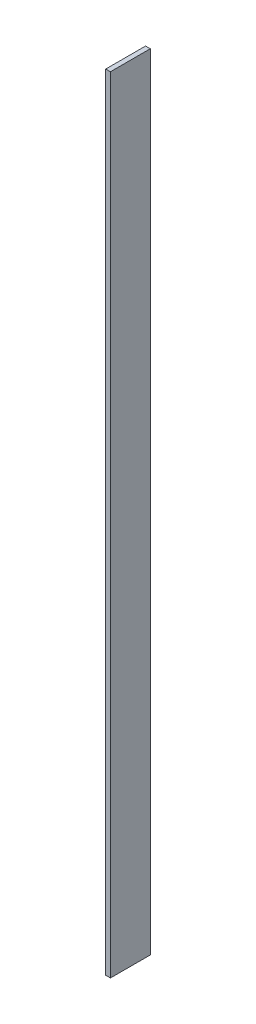
ISO-10303-21;
HEADER;
FILE_DESCRIPTION(('STEP AP214'),'2;1');
FILE_NAME('part.step','',(''),(''),'','','');
FILE_SCHEMA(('AUTOMOTIVE_DESIGN { 1 0 10303 214 1 1 1 1 }'));
ENDSEC;
DATA;
#1=APPLICATION_CONTEXT('core data for automotive mechanical design processes');
#2=APPLICATION_PROTOCOL_DEFINITION('international standard','automotive_design',2000,#1);
#3=PRODUCT_CONTEXT('',#1,'mechanical');
#4=PRODUCT('Part','Part','',(#3));
#5=PRODUCT_RELATED_PRODUCT_CATEGORY('part','',(#4));
#6=PRODUCT_DEFINITION_FORMATION('','',#4);
#7=PRODUCT_DEFINITION_CONTEXT('part definition',#1,'design');
#8=PRODUCT_DEFINITION('design','',#6,#7);
#9=PRODUCT_DEFINITION_SHAPE('','',#8);
#10=(LENGTH_UNIT() NAMED_UNIT(*) SI_UNIT(.MILLI.,.METRE.));
#11=(NAMED_UNIT(*) PLANE_ANGLE_UNIT() SI_UNIT($,.RADIAN.));
#12=(NAMED_UNIT(*) SI_UNIT($,.STERADIAN.) SOLID_ANGLE_UNIT());
#13=UNCERTAINTY_MEASURE_WITH_UNIT(LENGTH_MEASURE(1.E-05),#10,'distance_accuracy_value','');
#14=(GEOMETRIC_REPRESENTATION_CONTEXT(3) GLOBAL_UNCERTAINTY_ASSIGNED_CONTEXT((#13)) GLOBAL_UNIT_ASSIGNED_CONTEXT((#10,
#11,#12)) REPRESENTATION_CONTEXT('',''));
#15=CARTESIAN_POINT('',(0.,0.,0.));
#16=DIRECTION('',(0.,0.,1.));
#17=DIRECTION('',(1.,0.,0.));
#18=AXIS2_PLACEMENT_3D('',#15,#16,#17);
#19=CARTESIAN_POINT('',(3.00000000000045,0.,25.4000000000001));
#20=DIRECTION('',(-1.,0.,0.));
#21=DIRECTION('',(0.,0.,0.999999999999999));
#22=AXIS2_PLACEMENT_3D('',#19,#20,#21);
#23=PLANE('',#22);
#24=DIRECTION('',(0.,1.,0.));
#25=VECTOR('',#24,1.);
#26=CARTESIAN_POINT('',(3.00000000000045,-2.22044604925031E-13,0.));
#27=LINE('',#26,#25);
#28=CARTESIAN_POINT('',(3.00000000000045,-2.22044604925031E-13,0.));
#29=VERTEX_POINT('',#28);
#30=CARTESIAN_POINT('',(3.,500.,0.));
#31=VERTEX_POINT('',#30);
#32=EDGE_CURVE('E109',#29,#31,#27,.T.);
#33=ORIENTED_EDGE('',*,*,#32,.T.);
#34=DIRECTION('',(0.,0.,-0.999999999999999));
#35=VECTOR('',#34,1.);
#36=CARTESIAN_POINT('',(2.99999999999956,500.,25.3999999999999));
#37=LINE('',#36,#35);
#38=CARTESIAN_POINT('',(2.99999999999956,500.,25.3999999999999));
#39=VERTEX_POINT('',#38);
#40=EDGE_CURVE('E11',#39,#31,#37,.T.);
#41=ORIENTED_EDGE('',*,*,#40,.F.);
#42=DIRECTION('',(0.,1.,0.));
#43=VECTOR('',#42,1.);
#44=CARTESIAN_POINT('',(3.00000000000045,0.,25.4000000000001));
#45=LINE('',#44,#43);
#46=CARTESIAN_POINT('',(3.00000000000045,0.,25.4000000000001));
#47=VERTEX_POINT('',#46);
#48=EDGE_CURVE('E82',#47,#39,#45,.T.);
#49=ORIENTED_EDGE('',*,*,#48,.F.);
#50=DIRECTION('',(0.,0.,-0.999999999999999));
#51=VECTOR('',#50,1.);
#52=CARTESIAN_POINT('',(3.00000000000045,0.,25.4000000000001));
#53=LINE('',#52,#51);
#54=EDGE_CURVE('E58',#47,#29,#53,.T.);
#55=ORIENTED_EDGE('',*,*,#54,.T.);
#56=EDGE_LOOP('',(#33,#41,#49,#55));
#57=FACE_BOUND('',#56,.T.);
#58=ADVANCED_FACE('F41',(#57),#23,.F.);
#59=CARTESIAN_POINT('',(0.,500.,25.3999999999999));
#60=DIRECTION('',(0.,1.,0.));
#61=DIRECTION('',(0.,0.,0.999999999999999));
#62=AXIS2_PLACEMENT_3D('',#59,#60,#61);
#63=PLANE('',#62);
#64=DIRECTION('',(1.,0.,0.));
#65=VECTOR('',#64,1.);
#66=CARTESIAN_POINT('',(0.,500.,0.));
#67=LINE('',#66,#65);
#68=CARTESIAN_POINT('',(0.,500.,0.));
#69=VERTEX_POINT('',#68);
#70=EDGE_CURVE('E91',#69,#31,#67,.T.);
#71=ORIENTED_EDGE('',*,*,#70,.F.);
#72=DIRECTION('',(0.,0.,-0.999999999999999));
#73=VECTOR('',#72,1.);
#74=CARTESIAN_POINT('',(0.,500.,25.3999999999999));
#75=LINE('',#74,#73);
#76=CARTESIAN_POINT('',(0.,500.,25.3999999999999));
#77=VERTEX_POINT('',#76);
#78=EDGE_CURVE('E50',#77,#69,#75,.T.);
#79=ORIENTED_EDGE('',*,*,#78,.F.);
#80=DIRECTION('',(1.,0.,0.));
#81=VECTOR('',#80,1.);
#82=CARTESIAN_POINT('',(0.,500.,25.3999999999999));
#83=LINE('',#82,#81);
#84=EDGE_CURVE('E89',#77,#39,#83,.T.);
#85=ORIENTED_EDGE('',*,*,#84,.T.);
#86=ORIENTED_EDGE('',*,*,#40,.T.);
#87=EDGE_LOOP('',(#71,#79,#85,#86));
#88=FACE_BOUND('',#87,.T.);
#89=ADVANCED_FACE('F88',(#88),#63,.T.);
#90=CARTESIAN_POINT('',(0.,0.,25.4000000000001));
#91=DIRECTION('',(-1.,0.,0.));
#92=DIRECTION('',(0.,0.,0.999999999999999));
#93=AXIS2_PLACEMENT_3D('',#90,#91,#92);
#94=PLANE('',#93);
#95=DIRECTION('',(0.,1.,0.));
#96=VECTOR('',#95,1.);
#97=CARTESIAN_POINT('',(0.,0.,0.));
#98=LINE('',#97,#96);
#99=CARTESIAN_POINT('',(0.,0.,0.));
#100=VERTEX_POINT('',#99);
#101=EDGE_CURVE('E114',#100,#69,#98,.T.);
#102=ORIENTED_EDGE('',*,*,#101,.F.);
#103=DIRECTION('',(0.,0.,-0.999999999999999));
#104=VECTOR('',#103,1.);
#105=CARTESIAN_POINT('',(0.,0.,25.4000000000001));
#106=LINE('',#105,#104);
#107=CARTESIAN_POINT('',(0.,0.,25.4000000000001));
#108=VERTEX_POINT('',#107);
#109=EDGE_CURVE('E71',#108,#100,#106,.T.);
#110=ORIENTED_EDGE('',*,*,#109,.F.);
#111=DIRECTION('',(0.,1.,0.));
#112=VECTOR('',#111,1.);
#113=CARTESIAN_POINT('',(0.,0.,25.4000000000001));
#114=LINE('',#113,#112);
#115=EDGE_CURVE('E98',#108,#77,#114,.T.);
#116=ORIENTED_EDGE('',*,*,#115,.T.);
#117=ORIENTED_EDGE('',*,*,#78,.T.);
#118=EDGE_LOOP('',(#102,#110,#116,#117));
#119=FACE_BOUND('',#118,.T.);
#120=ADVANCED_FACE('F101',(#119),#94,.T.);
#121=CARTESIAN_POINT('',(3.00000000000045,0.,25.4000000000001));
#122=DIRECTION('',(0.,-1.,0.));
#123=DIRECTION('',(0.,0.,-0.999999999999999));
#124=AXIS2_PLACEMENT_3D('',#121,#122,#123);
#125=PLANE('',#124);
#126=DIRECTION('',(-1.,0.,0.));
#127=VECTOR('',#126,1.);
#128=CARTESIAN_POINT('',(3.00000000000045,-2.22044604925031E-13,0.));
#129=LINE('',#128,#127);
#130=EDGE_CURVE('E117',#29,#100,#129,.T.);
#131=ORIENTED_EDGE('',*,*,#130,.F.);
#132=ORIENTED_EDGE('',*,*,#54,.F.);
#133=DIRECTION('',(-1.,0.,0.));
#134=VECTOR('',#133,1.);
#135=CARTESIAN_POINT('',(3.00000000000045,0.,25.4000000000001));
#136=LINE('',#135,#134);
#137=EDGE_CURVE('E103',#47,#108,#136,.T.);
#138=ORIENTED_EDGE('',*,*,#137,.T.);
#139=ORIENTED_EDGE('',*,*,#109,.T.);
#140=EDGE_LOOP('',(#131,#132,#138,#139));
#141=FACE_BOUND('',#140,.T.);
#142=ADVANCED_FACE('F127',(#141),#125,.T.);
#143=CARTESIAN_POINT('',(0.,0.,25.4000000000001));
#144=DIRECTION('',(0.,0.,-0.999999999999999));
#145=DIRECTION('',(-1.,0.,0.));
#146=AXIS2_PLACEMENT_3D('',#143,#144,#145);
#147=PLANE('',#146);
#148=ORIENTED_EDGE('',*,*,#48,.T.);
#149=ORIENTED_EDGE('',*,*,#84,.F.);
#150=ORIENTED_EDGE('',*,*,#115,.F.);
#151=ORIENTED_EDGE('',*,*,#137,.F.);
#152=EDGE_LOOP('',(#148,#149,#150,#151));
#153=FACE_BOUND('',#152,.T.);
#154=ADVANCED_FACE('F97',(#153),#147,.F.);
#155=CARTESIAN_POINT('',(0.,0.,0.));
#156=DIRECTION('',(0.,0.,-0.999999999999999));
#157=DIRECTION('',(-1.,0.,0.));
#158=AXIS2_PLACEMENT_3D('',#155,#156,#157);
#159=PLANE('',#158);
#160=ORIENTED_EDGE('',*,*,#32,.F.);
#161=ORIENTED_EDGE('',*,*,#130,.T.);
#162=ORIENTED_EDGE('',*,*,#101,.T.);
#163=ORIENTED_EDGE('',*,*,#70,.T.);
#164=EDGE_LOOP('',(#160,#161,#162,#163));
#165=FACE_BOUND('',#164,.T.);
#166=ADVANCED_FACE('F126',(#165),#159,.T.);
#167=CLOSED_SHELL('',(#58,#89,#120,#142,#154,#166));
#168=MANIFOLD_SOLID_BREP('B2',#167);
#169=ADVANCED_BREP_SHAPE_REPRESENTATION('',(#18,#168),#14);
#170=SHAPE_DEFINITION_REPRESENTATION(#9,#169);
ENDSEC;
END-ISO-10303-21;
